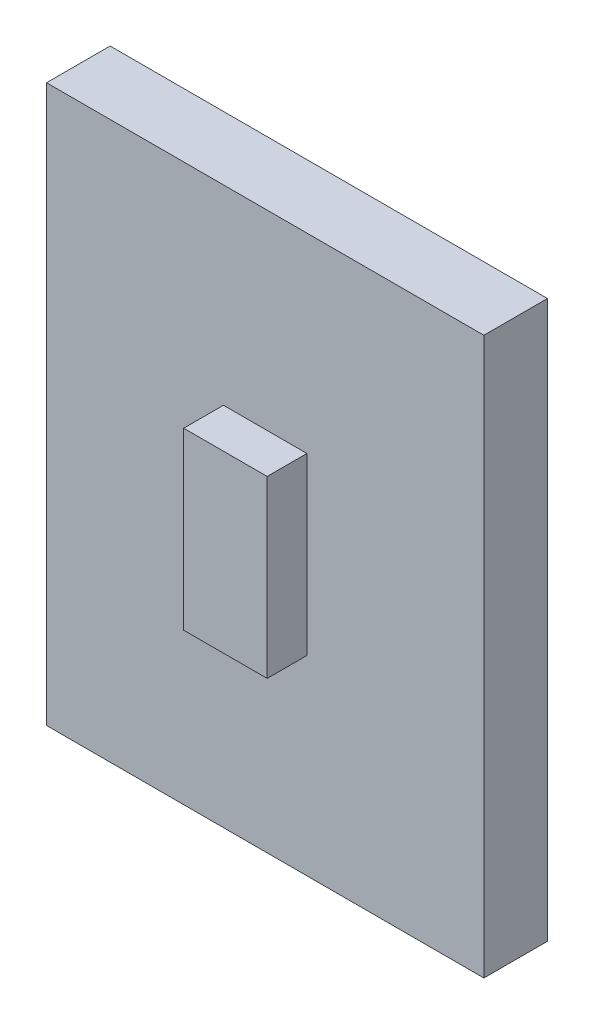
ISO-10303-21;
HEADER;
FILE_DESCRIPTION(('STEP AP214'),'2;1');
FILE_NAME('part.step','',(''),(''),'','','');
FILE_SCHEMA(('AUTOMOTIVE_DESIGN { 1 0 10303 214 1 1 1 1 }'));
ENDSEC;
DATA;
#1=APPLICATION_CONTEXT('core data for automotive mechanical design processes');
#2=APPLICATION_PROTOCOL_DEFINITION('international standard','automotive_design',2000,#1);
#3=PRODUCT_CONTEXT('',#1,'mechanical');
#4=PRODUCT('Part','Part','',(#3));
#5=PRODUCT_RELATED_PRODUCT_CATEGORY('part','',(#4));
#6=PRODUCT_DEFINITION_FORMATION('','',#4);
#7=PRODUCT_DEFINITION_CONTEXT('part definition',#1,'design');
#8=PRODUCT_DEFINITION('design','',#6,#7);
#9=PRODUCT_DEFINITION_SHAPE('','',#8);
#10=(LENGTH_UNIT() NAMED_UNIT(*) SI_UNIT(.MILLI.,.METRE.));
#11=(NAMED_UNIT(*) PLANE_ANGLE_UNIT() SI_UNIT($,.RADIAN.));
#12=(NAMED_UNIT(*) SI_UNIT($,.STERADIAN.) SOLID_ANGLE_UNIT());
#13=UNCERTAINTY_MEASURE_WITH_UNIT(LENGTH_MEASURE(1.E-05),#10,'distance_accuracy_value','');
#14=(GEOMETRIC_REPRESENTATION_CONTEXT(3) GLOBAL_UNCERTAINTY_ASSIGNED_CONTEXT((#13)) GLOBAL_UNIT_ASSIGNED_CONTEXT((#10,
#11,#12)) REPRESENTATION_CONTEXT('',''));
#15=CARTESIAN_POINT('',(0.,0.,0.));
#16=DIRECTION('',(0.,0.,1.));
#17=DIRECTION('',(1.,0.,0.));
#18=AXIS2_PLACEMENT_3D('',#15,#16,#17);
#19=CARTESIAN_POINT('',(0.,0.,1.6));
#20=DIRECTION('',(0.,0.,-1.));
#21=DIRECTION('',(-1.,0.,0.));
#22=AXIS2_PLACEMENT_3D('',#19,#20,#21);
#23=PLANE('',#22);
#24=DIRECTION('',(0.,-1.,0.));
#25=VECTOR('',#24,1.);
#26=CARTESIAN_POINT('',(0.,0.,1.6));
#27=LINE('',#26,#25);
#28=CARTESIAN_POINT('',(0.,14.,1.6));
#29=VERTEX_POINT('',#28);
#30=CARTESIAN_POINT('',(0.,0.,1.6));
#31=VERTEX_POINT('',#30);
#32=EDGE_CURVE('E129',#29,#31,#27,.T.);
#33=ORIENTED_EDGE('',*,*,#32,.T.);
#34=DIRECTION('',(1.,0.,0.));
#35=VECTOR('',#34,1.);
#36=CARTESIAN_POINT('',(0.,0.,1.6));
#37=LINE('',#36,#35);
#38=CARTESIAN_POINT('',(11.,0.,1.6));
#39=VERTEX_POINT('',#38);
#40=EDGE_CURVE('E132',#31,#39,#37,.T.);
#41=ORIENTED_EDGE('',*,*,#40,.T.);
#42=DIRECTION('',(0.,1.,0.));
#43=VECTOR('',#42,1.);
#44=CARTESIAN_POINT('',(11.,0.,1.6));
#45=LINE('',#44,#43);
#46=CARTESIAN_POINT('',(11.,14.,1.6));
#47=VERTEX_POINT('',#46);
#48=EDGE_CURVE('E135',#39,#47,#45,.T.);
#49=ORIENTED_EDGE('',*,*,#48,.T.);
#50=DIRECTION('',(-1.,0.,0.));
#51=VECTOR('',#50,1.);
#52=CARTESIAN_POINT('',(0.,14.,1.6));
#53=LINE('',#52,#51);
#54=EDGE_CURVE('E137',#47,#29,#53,.T.);
#55=ORIENTED_EDGE('',*,*,#54,.T.);
#56=EDGE_LOOP('',(#33,#41,#49,#55));
#57=FACE_BOUND('',#56,.T.);
#58=DIRECTION('',(1.,0.,0.));
#59=VECTOR('',#58,1.);
#60=CARTESIAN_POINT('',(6.55,4.8,1.6));
#61=LINE('',#60,#59);
#62=CARTESIAN_POINT('',(4.45,4.8,1.6));
#63=VERTEX_POINT('',#62);
#64=CARTESIAN_POINT('',(6.55,4.8,1.6));
#65=VERTEX_POINT('',#64);
#66=EDGE_CURVE('E119',#63,#65,#61,.T.);
#67=ORIENTED_EDGE('',*,*,#66,.F.);
#68=DIRECTION('',(0.,-1.,0.));
#69=VECTOR('',#68,1.);
#70=CARTESIAN_POINT('',(4.45,9.2,1.6));
#71=LINE('',#70,#69);
#72=CARTESIAN_POINT('',(4.45,9.2,1.6));
#73=VERTEX_POINT('',#72);
#74=EDGE_CURVE('E116',#73,#63,#71,.T.);
#75=ORIENTED_EDGE('',*,*,#74,.F.);
#76=DIRECTION('',(-1.,0.,0.));
#77=VECTOR('',#76,1.);
#78=CARTESIAN_POINT('',(6.55,9.19999999999999,1.6));
#79=LINE('',#78,#77);
#80=CARTESIAN_POINT('',(6.55,9.19999999999999,1.6));
#81=VERTEX_POINT('',#80);
#82=EDGE_CURVE('E54',#81,#73,#79,.T.);
#83=ORIENTED_EDGE('',*,*,#82,.F.);
#84=DIRECTION('',(0.,1.,0.));
#85=VECTOR('',#84,1.);
#86=CARTESIAN_POINT('',(6.55,9.19999999999999,1.6));
#87=LINE('',#86,#85);
#88=EDGE_CURVE('E49',#65,#81,#87,.T.);
#89=ORIENTED_EDGE('',*,*,#88,.F.);
#90=EDGE_LOOP('',(#67,#75,#83,#89));
#91=FACE_BOUND('',#90,.T.);
#92=ADVANCED_FACE('F34',(#57,#91),#23,.F.);
#93=CARTESIAN_POINT('',(0.,0.,1.6));
#94=DIRECTION('',(1.,0.,0.));
#95=DIRECTION('',(0.,0.,-1.));
#96=AXIS2_PLACEMENT_3D('',#93,#94,#95);
#97=PLANE('',#96);
#98=DIRECTION('',(0.,-1.,0.));
#99=VECTOR('',#98,1.);
#100=CARTESIAN_POINT('',(0.,0.,0.));
#101=LINE('',#100,#99);
#102=CARTESIAN_POINT('',(0.,14.,0.));
#103=VERTEX_POINT('',#102);
#104=CARTESIAN_POINT('',(0.,0.,0.));
#105=VERTEX_POINT('',#104);
#106=EDGE_CURVE('E120',#103,#105,#101,.T.);
#107=ORIENTED_EDGE('',*,*,#106,.T.);
#108=DIRECTION('',(0.,0.,-1.));
#109=VECTOR('',#108,1.);
#110=CARTESIAN_POINT('',(0.,0.,1.6));
#111=LINE('',#110,#109);
#112=EDGE_CURVE('E11',#31,#105,#111,.T.);
#113=ORIENTED_EDGE('',*,*,#112,.F.);
#114=ORIENTED_EDGE('',*,*,#32,.F.);
#115=DIRECTION('',(0.,0.,-1.));
#116=VECTOR('',#115,1.);
#117=CARTESIAN_POINT('',(0.,14.,1.6));
#118=LINE('',#117,#116);
#119=EDGE_CURVE('E138',#29,#103,#118,.T.);
#120=ORIENTED_EDGE('',*,*,#119,.T.);
#121=EDGE_LOOP('',(#107,#113,#114,#120));
#122=FACE_BOUND('',#121,.T.);
#123=ADVANCED_FACE('F36',(#122),#97,.F.);
#124=CARTESIAN_POINT('',(0.,0.,1.6));
#125=DIRECTION('',(0.,1.,0.));
#126=DIRECTION('',(0.,0.,1.));
#127=AXIS2_PLACEMENT_3D('',#124,#125,#126);
#128=PLANE('',#127);
#129=DIRECTION('',(1.,0.,0.));
#130=VECTOR('',#129,1.);
#131=CARTESIAN_POINT('',(0.,0.,0.));
#132=LINE('',#131,#130);
#133=CARTESIAN_POINT('',(11.,0.,0.));
#134=VERTEX_POINT('',#133);
#135=EDGE_CURVE('E123',#105,#134,#132,.T.);
#136=ORIENTED_EDGE('',*,*,#135,.T.);
#137=DIRECTION('',(0.,0.,-1.));
#138=VECTOR('',#137,1.);
#139=CARTESIAN_POINT('',(11.,0.,1.6));
#140=LINE('',#139,#138);
#141=EDGE_CURVE('E42',#39,#134,#140,.T.);
#142=ORIENTED_EDGE('',*,*,#141,.F.);
#143=ORIENTED_EDGE('',*,*,#40,.F.);
#144=ORIENTED_EDGE('',*,*,#112,.T.);
#145=EDGE_LOOP('',(#136,#142,#143,#144));
#146=FACE_BOUND('',#145,.T.);
#147=ADVANCED_FACE('F168',(#146),#128,.F.);
#148=CARTESIAN_POINT('',(11.,0.,1.6));
#149=DIRECTION('',(-1.,0.,0.));
#150=DIRECTION('',(0.,0.,1.));
#151=AXIS2_PLACEMENT_3D('',#148,#149,#150);
#152=PLANE('',#151);
#153=DIRECTION('',(0.,1.,0.));
#154=VECTOR('',#153,1.);
#155=CARTESIAN_POINT('',(11.,0.,0.));
#156=LINE('',#155,#154);
#157=CARTESIAN_POINT('',(11.,14.,0.));
#158=VERTEX_POINT('',#157);
#159=EDGE_CURVE('E141',#134,#158,#156,.T.);
#160=ORIENTED_EDGE('',*,*,#159,.T.);
#161=DIRECTION('',(0.,0.,-1.));
#162=VECTOR('',#161,1.);
#163=CARTESIAN_POINT('',(11.,14.,1.6));
#164=LINE('',#163,#162);
#165=EDGE_CURVE('E146',#47,#158,#164,.T.);
#166=ORIENTED_EDGE('',*,*,#165,.F.);
#167=ORIENTED_EDGE('',*,*,#48,.F.);
#168=ORIENTED_EDGE('',*,*,#141,.T.);
#169=EDGE_LOOP('',(#160,#166,#167,#168));
#170=FACE_BOUND('',#169,.T.);
#171=ADVANCED_FACE('F153',(#170),#152,.F.);
#172=CARTESIAN_POINT('',(0.,14.,1.6));
#173=DIRECTION('',(0.,-1.,0.));
#174=DIRECTION('',(0.,0.,-1.));
#175=AXIS2_PLACEMENT_3D('',#172,#173,#174);
#176=PLANE('',#175);
#177=DIRECTION('',(-1.,0.,0.));
#178=VECTOR('',#177,1.);
#179=CARTESIAN_POINT('',(0.,14.,0.));
#180=LINE('',#179,#178);
#181=EDGE_CURVE('E133',#158,#103,#180,.T.);
#182=ORIENTED_EDGE('',*,*,#181,.T.);
#183=ORIENTED_EDGE('',*,*,#119,.F.);
#184=ORIENTED_EDGE('',*,*,#54,.F.);
#185=ORIENTED_EDGE('',*,*,#165,.T.);
#186=EDGE_LOOP('',(#182,#183,#184,#185));
#187=FACE_BOUND('',#186,.T.);
#188=ADVANCED_FACE('F162',(#187),#176,.F.);
#189=CARTESIAN_POINT('',(0.,0.,0.));
#190=DIRECTION('',(0.,0.,-1.));
#191=DIRECTION('',(-1.,0.,0.));
#192=AXIS2_PLACEMENT_3D('',#189,#190,#191);
#193=PLANE('',#192);
#194=ORIENTED_EDGE('',*,*,#106,.F.);
#195=ORIENTED_EDGE('',*,*,#181,.F.);
#196=ORIENTED_EDGE('',*,*,#159,.F.);
#197=ORIENTED_EDGE('',*,*,#135,.F.);
#198=EDGE_LOOP('',(#194,#195,#196,#197));
#199=FACE_BOUND('',#198,.T.);
#200=ADVANCED_FACE('F159',(#199),#193,.T.);
#201=CARTESIAN_POINT('',(6.55,4.8,2.6));
#202=DIRECTION('',(0.,1.,0.));
#203=DIRECTION('',(-1.,0.,0.));
#204=AXIS2_PLACEMENT_3D('',#201,#202,#203);
#205=PLANE('',#204);
#206=ORIENTED_EDGE('',*,*,#66,.T.);
#207=DIRECTION('',(0.,0.,-1.));
#208=VECTOR('',#207,1.);
#209=CARTESIAN_POINT('',(6.55,4.8,2.6));
#210=LINE('',#209,#208);
#211=CARTESIAN_POINT('',(6.55,4.8,2.6));
#212=VERTEX_POINT('',#211);
#213=EDGE_CURVE('E100',#212,#65,#210,.T.);
#214=ORIENTED_EDGE('',*,*,#213,.F.);
#215=DIRECTION('',(1.,0.,0.));
#216=VECTOR('',#215,1.);
#217=CARTESIAN_POINT('',(6.55,4.8,2.6));
#218=LINE('',#217,#216);
#219=CARTESIAN_POINT('',(4.45,4.8,2.6));
#220=VERTEX_POINT('',#219);
#221=EDGE_CURVE('E107',#220,#212,#218,.T.);
#222=ORIENTED_EDGE('',*,*,#221,.F.);
#223=DIRECTION('',(0.,0.,-1.));
#224=VECTOR('',#223,1.);
#225=CARTESIAN_POINT('',(4.45,4.8,2.6));
#226=LINE('',#225,#224);
#227=EDGE_CURVE('E261',#220,#63,#226,.T.);
#228=ORIENTED_EDGE('',*,*,#227,.T.);
#229=EDGE_LOOP('',(#206,#214,#222,#228));
#230=FACE_BOUND('',#229,.T.);
#231=ADVANCED_FACE('F118',(#230),#205,.F.);
#232=CARTESIAN_POINT('',(6.55,9.19999999999999,2.6));
#233=DIRECTION('',(-1.,0.,0.));
#234=DIRECTION('',(0.,-1.,0.));
#235=AXIS2_PLACEMENT_3D('',#232,#233,#234);
#236=PLANE('',#235);
#237=ORIENTED_EDGE('',*,*,#88,.T.);
#238=DIRECTION('',(0.,0.,-1.));
#239=VECTOR('',#238,1.);
#240=CARTESIAN_POINT('',(6.55,9.19999999999999,2.6));
#241=LINE('',#240,#239);
#242=CARTESIAN_POINT('',(6.55,9.19999999999999,2.6));
#243=VERTEX_POINT('',#242);
#244=EDGE_CURVE('E103',#243,#81,#241,.T.);
#245=ORIENTED_EDGE('',*,*,#244,.F.);
#246=DIRECTION('',(0.,1.,0.));
#247=VECTOR('',#246,1.);
#248=CARTESIAN_POINT('',(6.55,9.19999999999999,2.6));
#249=LINE('',#248,#247);
#250=EDGE_CURVE('E96',#212,#243,#249,.T.);
#251=ORIENTED_EDGE('',*,*,#250,.F.);
#252=ORIENTED_EDGE('',*,*,#213,.T.);
#253=EDGE_LOOP('',(#237,#245,#251,#252));
#254=FACE_BOUND('',#253,.T.);
#255=ADVANCED_FACE('F98',(#254),#236,.F.);
#256=CARTESIAN_POINT('',(6.55,9.19999999999999,2.6));
#257=DIRECTION('',(0.,-1.,0.));
#258=DIRECTION('',(1.,0.,0.));
#259=AXIS2_PLACEMENT_3D('',#256,#257,#258);
#260=PLANE('',#259);
#261=ORIENTED_EDGE('',*,*,#82,.T.);
#262=DIRECTION('',(0.,0.,-1.));
#263=VECTOR('',#262,1.);
#264=CARTESIAN_POINT('',(4.45,9.2,2.6));
#265=LINE('',#264,#263);
#266=CARTESIAN_POINT('',(4.45,9.2,2.6));
#267=VERTEX_POINT('',#266);
#268=EDGE_CURVE('E125',#267,#73,#265,.T.);
#269=ORIENTED_EDGE('',*,*,#268,.F.);
#270=DIRECTION('',(-1.,0.,0.));
#271=VECTOR('',#270,1.);
#272=CARTESIAN_POINT('',(6.55,9.19999999999999,2.6));
#273=LINE('',#272,#271);
#274=EDGE_CURVE('E106',#243,#267,#273,.T.);
#275=ORIENTED_EDGE('',*,*,#274,.F.);
#276=ORIENTED_EDGE('',*,*,#244,.T.);
#277=EDGE_LOOP('',(#261,#269,#275,#276));
#278=FACE_BOUND('',#277,.T.);
#279=ADVANCED_FACE('F204',(#278),#260,.F.);
#280=CARTESIAN_POINT('',(4.45,9.2,2.6));
#281=DIRECTION('',(1.,0.,0.));
#282=DIRECTION('',(0.,1.,0.));
#283=AXIS2_PLACEMENT_3D('',#280,#281,#282);
#284=PLANE('',#283);
#285=ORIENTED_EDGE('',*,*,#74,.T.);
#286=ORIENTED_EDGE('',*,*,#227,.F.);
#287=DIRECTION('',(0.,-1.,0.));
#288=VECTOR('',#287,1.);
#289=CARTESIAN_POINT('',(4.45,9.2,2.6));
#290=LINE('',#289,#288);
#291=EDGE_CURVE('E112',#267,#220,#290,.T.);
#292=ORIENTED_EDGE('',*,*,#291,.F.);
#293=ORIENTED_EDGE('',*,*,#268,.T.);
#294=EDGE_LOOP('',(#285,#286,#292,#293));
#295=FACE_BOUND('',#294,.T.);
#296=ADVANCED_FACE('F210',(#295),#284,.F.);
#297=CARTESIAN_POINT('',(0.,0.,2.6));
#298=DIRECTION('',(0.,0.,1.));
#299=DIRECTION('',(1.,0.,0.));
#300=AXIS2_PLACEMENT_3D('',#297,#298,#299);
#301=PLANE('',#300);
#302=ORIENTED_EDGE('',*,*,#221,.T.);
#303=ORIENTED_EDGE('',*,*,#250,.T.);
#304=ORIENTED_EDGE('',*,*,#274,.T.);
#305=ORIENTED_EDGE('',*,*,#291,.T.);
#306=EDGE_LOOP('',(#302,#303,#304,#305));
#307=FACE_BOUND('',#306,.T.);
#308=ADVANCED_FACE('F110',(#307),#301,.T.);
#309=CLOSED_SHELL('',(#92,#123,#147,#171,#188,#200,#231,#255,#279,#296,#308));
#310=MANIFOLD_SOLID_BREP('B2',#309);
#311=ADVANCED_BREP_SHAPE_REPRESENTATION('',(#18,#310),#14);
#312=SHAPE_DEFINITION_REPRESENTATION(#9,#311);
ENDSEC;
END-ISO-10303-21;
